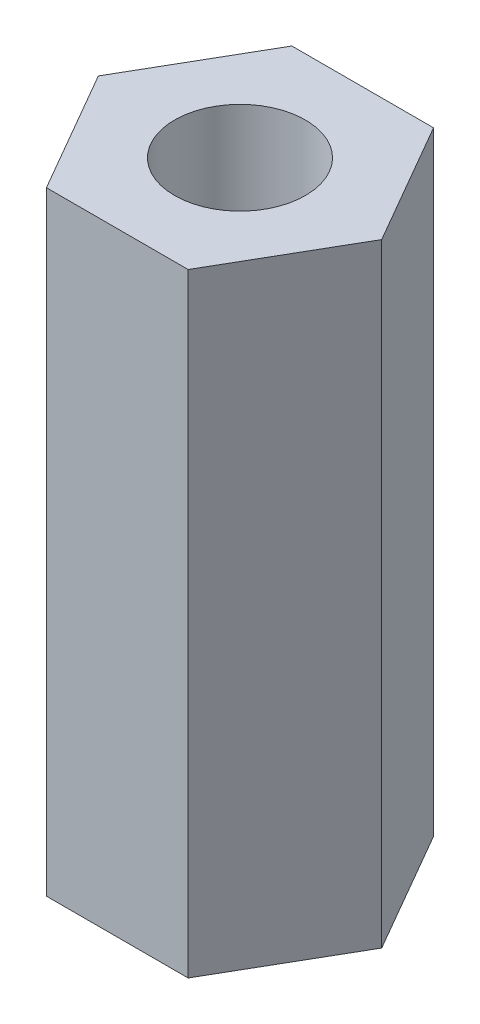
ISO-10303-21;
HEADER;
FILE_DESCRIPTION(('STEP AP214'),'2;1');
FILE_NAME('part.step','',(''),(''),'','','');
FILE_SCHEMA(('AUTOMOTIVE_DESIGN { 1 0 10303 214 1 1 1 1 }'));
ENDSEC;
DATA;
#1=APPLICATION_CONTEXT('core data for automotive mechanical design processes');
#2=APPLICATION_PROTOCOL_DEFINITION('international standard','automotive_design',2000,#1);
#3=PRODUCT_CONTEXT('',#1,'mechanical');
#4=PRODUCT('Part','Part','',(#3));
#5=PRODUCT_RELATED_PRODUCT_CATEGORY('part','',(#4));
#6=PRODUCT_DEFINITION_FORMATION('','',#4);
#7=PRODUCT_DEFINITION_CONTEXT('part definition',#1,'design');
#8=PRODUCT_DEFINITION('design','',#6,#7);
#9=PRODUCT_DEFINITION_SHAPE('','',#8);
#10=(LENGTH_UNIT() NAMED_UNIT(*) SI_UNIT(.MILLI.,.METRE.));
#11=(NAMED_UNIT(*) PLANE_ANGLE_UNIT() SI_UNIT($,.RADIAN.));
#12=(NAMED_UNIT(*) SI_UNIT($,.STERADIAN.) SOLID_ANGLE_UNIT());
#13=UNCERTAINTY_MEASURE_WITH_UNIT(LENGTH_MEASURE(1.E-05),#10,'distance_accuracy_value','');
#14=(GEOMETRIC_REPRESENTATION_CONTEXT(3) GLOBAL_UNCERTAINTY_ASSIGNED_CONTEXT((#13)) GLOBAL_UNIT_ASSIGNED_CONTEXT((#10,
#11,#12)) REPRESENTATION_CONTEXT('',''));
#15=CARTESIAN_POINT('',(0.,0.,0.));
#16=DIRECTION('',(0.,0.,1.));
#17=DIRECTION('',(1.,0.,0.));
#18=AXIS2_PLACEMENT_3D('',#15,#16,#17);
#19=CARTESIAN_POINT('',(0.,15.,0.));
#20=DIRECTION('',(0.,1.,0.));
#21=DIRECTION('',(0.,0.,1.));
#22=AXIS2_PLACEMENT_3D('',#19,#20,#21);
#23=PLANE('',#22);
#24=DIRECTION('',(0.499999999999995,0.,-0.866025403784441));
#25=VECTOR('',#24,1.);
#26=CARTESIAN_POINT('',(1.73205080756891,15.,2.99999999999997));
#27=LINE('',#26,#25);
#28=CARTESIAN_POINT('',(1.73205080756891,15.,2.99999999999997));
#29=VERTEX_POINT('',#28);
#30=CARTESIAN_POINT('',(3.46410161513774,15.,0.));
#31=VERTEX_POINT('',#30);
#32=EDGE_CURVE('E137',#29,#31,#27,.T.);
#33=ORIENTED_EDGE('',*,*,#32,.T.);
#34=DIRECTION('',(-0.500000000000001,0.,-0.866025403784438));
#35=VECTOR('',#34,1.);
#36=CARTESIAN_POINT('',(3.46410161513774,15.,0.));
#37=LINE('',#36,#35);
#38=CARTESIAN_POINT('',(1.73205080756886,15.,-2.99999999999999));
#39=VERTEX_POINT('',#38);
#40=EDGE_CURVE('E95',#31,#39,#37,.T.);
#41=ORIENTED_EDGE('',*,*,#40,.T.);
#42=DIRECTION('',(-1.,0.,0.));
#43=VECTOR('',#42,1.);
#44=CARTESIAN_POINT('',(1.73205080756886,15.,-2.99999999999999));
#45=LINE('',#44,#43);
#46=CARTESIAN_POINT('',(-1.73205080756889,15.,-2.99999999999998));
#47=VERTEX_POINT('',#46);
#48=EDGE_CURVE('E108',#39,#47,#45,.T.);
#49=ORIENTED_EDGE('',*,*,#48,.T.);
#50=DIRECTION('',(-0.499999999999995,0.,0.866025403784442));
#51=VECTOR('',#50,1.);
#52=CARTESIAN_POINT('',(-1.73205080756889,15.,-2.99999999999998));
#53=LINE('',#52,#51);
#54=CARTESIAN_POINT('',(-3.46410161513774,15.,0.));
#55=VERTEX_POINT('',#54);
#56=EDGE_CURVE('E102',#47,#55,#53,.T.);
#57=ORIENTED_EDGE('',*,*,#56,.T.);
#58=DIRECTION('',(0.500000000000007,0.,0.866025403784435));
#59=VECTOR('',#58,1.);
#60=CARTESIAN_POINT('',(-3.46410161513774,15.,0.));
#61=LINE('',#60,#59);
#62=CARTESIAN_POINT('',(-1.73205080756884,15.,3.00000000000001));
#63=VERTEX_POINT('',#62);
#64=EDGE_CURVE('E106',#55,#63,#61,.T.);
#65=ORIENTED_EDGE('',*,*,#64,.T.);
#66=DIRECTION('',(1.,0.,0.));
#67=VECTOR('',#66,1.);
#68=CARTESIAN_POINT('',(-1.73205080756884,15.,3.00000000000001));
#69=LINE('',#68,#67);
#70=EDGE_CURVE('E58',#63,#29,#69,.T.);
#71=ORIENTED_EDGE('',*,*,#70,.T.);
#72=EDGE_LOOP('',(#33,#41,#49,#57,#65,#71));
#73=FACE_BOUND('',#72,.T.);
#74=CARTESIAN_POINT('',(0.,15.,0.));
#75=DIRECTION('',(0.,1.,0.));
#76=DIRECTION('',(0.,0.,1.));
#77=AXIS2_PLACEMENT_3D('',#74,#75,#76);
#78=CIRCLE('',#77,1.6);
#79=CARTESIAN_POINT('',(0.,15.,1.6));
#80=VERTEX_POINT('',#79);
#81=EDGE_CURVE('E130',#80,#80,#78,.T.);
#82=ORIENTED_EDGE('',*,*,#81,.F.);
#83=EDGE_LOOP('',(#82));
#84=FACE_BOUND('',#83,.T.);
#85=ADVANCED_FACE('F41',(#73,#84),#23,.T.);
#86=CARTESIAN_POINT('',(0.,0.,0.));
#87=DIRECTION('',(0.,1.,0.));
#88=DIRECTION('',(0.,0.,1.));
#89=AXIS2_PLACEMENT_3D('',#86,#87,#88);
#90=PLANE('',#89);
#91=DIRECTION('',(0.499999999999995,0.,-0.866025403784441));
#92=VECTOR('',#91,1.);
#93=CARTESIAN_POINT('',(1.73205080756891,0.,2.99999999999997));
#94=LINE('',#93,#92);
#95=CARTESIAN_POINT('',(1.73205080756891,0.,2.99999999999997));
#96=VERTEX_POINT('',#95);
#97=CARTESIAN_POINT('',(3.46410161513774,0.,0.));
#98=VERTEX_POINT('',#97);
#99=EDGE_CURVE('E126',#96,#98,#94,.T.);
#100=ORIENTED_EDGE('',*,*,#99,.F.);
#101=DIRECTION('',(1.,0.,0.));
#102=VECTOR('',#101,1.);
#103=CARTESIAN_POINT('',(-1.73205080756884,0.,3.00000000000001));
#104=LINE('',#103,#102);
#105=CARTESIAN_POINT('',(-1.73205080756884,0.,3.00000000000001));
#106=VERTEX_POINT('',#105);
#107=EDGE_CURVE('E87',#106,#96,#104,.T.);
#108=ORIENTED_EDGE('',*,*,#107,.F.);
#109=DIRECTION('',(0.500000000000007,0.,0.866025403784435));
#110=VECTOR('',#109,1.);
#111=CARTESIAN_POINT('',(-3.46410161513774,0.,0.));
#112=LINE('',#111,#110);
#113=CARTESIAN_POINT('',(-3.46410161513774,0.,0.));
#114=VERTEX_POINT('',#113);
#115=EDGE_CURVE('E81',#114,#106,#112,.T.);
#116=ORIENTED_EDGE('',*,*,#115,.F.);
#117=DIRECTION('',(-0.499999999999995,0.,0.866025403784442));
#118=VECTOR('',#117,1.);
#119=CARTESIAN_POINT('',(-1.73205080756889,0.,-2.99999999999998));
#120=LINE('',#119,#118);
#121=CARTESIAN_POINT('',(-1.73205080756889,0.,-2.99999999999998));
#122=VERTEX_POINT('',#121);
#123=EDGE_CURVE('E116',#122,#114,#120,.T.);
#124=ORIENTED_EDGE('',*,*,#123,.F.);
#125=DIRECTION('',(-1.,0.,0.));
#126=VECTOR('',#125,1.);
#127=CARTESIAN_POINT('',(1.73205080756886,0.,-2.99999999999999));
#128=LINE('',#127,#126);
#129=CARTESIAN_POINT('',(1.73205080756886,0.,-2.99999999999999));
#130=VERTEX_POINT('',#129);
#131=EDGE_CURVE('E132',#130,#122,#128,.T.);
#132=ORIENTED_EDGE('',*,*,#131,.F.);
#133=DIRECTION('',(-0.500000000000001,0.,-0.866025403784438));
#134=VECTOR('',#133,1.);
#135=CARTESIAN_POINT('',(3.46410161513774,0.,0.));
#136=LINE('',#135,#134);
#137=EDGE_CURVE('E129',#98,#130,#136,.T.);
#138=ORIENTED_EDGE('',*,*,#137,.F.);
#139=EDGE_LOOP('',(#100,#108,#116,#124,#132,#138));
#140=FACE_BOUND('',#139,.T.);
#141=CARTESIAN_POINT('',(0.,0.,0.));
#142=DIRECTION('',(0.,1.,0.));
#143=DIRECTION('',(0.,0.,1.));
#144=AXIS2_PLACEMENT_3D('',#141,#142,#143);
#145=CIRCLE('',#144,1.6);
#146=CARTESIAN_POINT('',(0.,0.,1.6));
#147=VERTEX_POINT('',#146);
#148=EDGE_CURVE('E238',#147,#147,#145,.T.);
#149=ORIENTED_EDGE('',*,*,#148,.T.);
#150=EDGE_LOOP('',(#149));
#151=FACE_BOUND('',#150,.T.);
#152=ADVANCED_FACE('F146',(#140,#151),#90,.F.);
#153=CARTESIAN_POINT('',(1.73205080756891,15.,2.99999999999997));
#154=DIRECTION('',(-0.866025403784442,0.,-0.499999999999995));
#155=DIRECTION('',(-0.499999999999995,0.,0.866025403784442));
#156=AXIS2_PLACEMENT_3D('',#153,#154,#155);
#157=PLANE('',#156);
#158=ORIENTED_EDGE('',*,*,#99,.T.);
#159=DIRECTION('',(0.,-1.,0.));
#160=VECTOR('',#159,1.);
#161=CARTESIAN_POINT('',(3.46410161513774,15.,0.));
#162=LINE('',#161,#160);
#163=EDGE_CURVE('E11',#31,#98,#162,.T.);
#164=ORIENTED_EDGE('',*,*,#163,.F.);
#165=ORIENTED_EDGE('',*,*,#32,.F.);
#166=DIRECTION('',(0.,-1.,0.));
#167=VECTOR('',#166,1.);
#168=CARTESIAN_POINT('',(1.73205080756891,15.,2.99999999999997));
#169=LINE('',#168,#167);
#170=EDGE_CURVE('E122',#29,#96,#169,.T.);
#171=ORIENTED_EDGE('',*,*,#170,.T.);
#172=EDGE_LOOP('',(#158,#164,#165,#171));
#173=FACE_BOUND('',#172,.T.);
#174=ADVANCED_FACE('F43',(#173),#157,.F.);
#175=CARTESIAN_POINT('',(3.46410161513774,15.,0.));
#176=DIRECTION('',(-0.866025403784438,0.,0.500000000000001));
#177=DIRECTION('',(0.500000000000001,0.,0.866025403784438));
#178=AXIS2_PLACEMENT_3D('',#175,#176,#177);
#179=PLANE('',#178);
#180=ORIENTED_EDGE('',*,*,#137,.T.);
#181=DIRECTION('',(0.,-1.,0.));
#182=VECTOR('',#181,1.);
#183=CARTESIAN_POINT('',(1.73205080756886,15.,-2.99999999999999));
#184=LINE('',#183,#182);
#185=EDGE_CURVE('E50',#39,#130,#184,.T.);
#186=ORIENTED_EDGE('',*,*,#185,.F.);
#187=ORIENTED_EDGE('',*,*,#40,.F.);
#188=ORIENTED_EDGE('',*,*,#163,.T.);
#189=EDGE_LOOP('',(#180,#186,#187,#188));
#190=FACE_BOUND('',#189,.T.);
#191=ADVANCED_FACE('F171',(#190),#179,.F.);
#192=CARTESIAN_POINT('',(1.73205080756886,15.,-2.99999999999999));
#193=DIRECTION('',(0.,0.,1.));
#194=DIRECTION('',(1.,0.,0.));
#195=AXIS2_PLACEMENT_3D('',#192,#193,#194);
#196=PLANE('',#195);
#197=ORIENTED_EDGE('',*,*,#131,.T.);
#198=DIRECTION('',(0.,-1.,0.));
#199=VECTOR('',#198,1.);
#200=CARTESIAN_POINT('',(-1.73205080756889,15.,-2.99999999999998));
#201=LINE('',#200,#199);
#202=EDGE_CURVE('E117',#47,#122,#201,.T.);
#203=ORIENTED_EDGE('',*,*,#202,.F.);
#204=ORIENTED_EDGE('',*,*,#48,.F.);
#205=ORIENTED_EDGE('',*,*,#185,.T.);
#206=EDGE_LOOP('',(#197,#203,#204,#205));
#207=FACE_BOUND('',#206,.T.);
#208=ADVANCED_FACE('F143',(#207),#196,.F.);
#209=CARTESIAN_POINT('',(-1.73205080756889,15.,-2.99999999999998));
#210=DIRECTION('',(0.866025403784442,0.,0.499999999999995));
#211=DIRECTION('',(0.499999999999995,0.,-0.866025403784442));
#212=AXIS2_PLACEMENT_3D('',#209,#210,#211);
#213=PLANE('',#212);
#214=ORIENTED_EDGE('',*,*,#123,.T.);
#215=DIRECTION('',(0.,-1.,0.));
#216=VECTOR('',#215,1.);
#217=CARTESIAN_POINT('',(-3.46410161513774,15.,0.));
#218=LINE('',#217,#216);
#219=EDGE_CURVE('E113',#55,#114,#218,.T.);
#220=ORIENTED_EDGE('',*,*,#219,.F.);
#221=ORIENTED_EDGE('',*,*,#56,.F.);
#222=ORIENTED_EDGE('',*,*,#202,.T.);
#223=EDGE_LOOP('',(#214,#220,#221,#222));
#224=FACE_BOUND('',#223,.T.);
#225=ADVANCED_FACE('F114',(#224),#213,.F.);
#226=CARTESIAN_POINT('',(-3.46410161513774,15.,0.));
#227=DIRECTION('',(0.866025403784435,0.,-0.500000000000007));
#228=DIRECTION('',(-0.500000000000007,0.,-0.866025403784435));
#229=AXIS2_PLACEMENT_3D('',#226,#227,#228);
#230=PLANE('',#229);
#231=ORIENTED_EDGE('',*,*,#115,.T.);
#232=DIRECTION('',(0.,-1.,0.));
#233=VECTOR('',#232,1.);
#234=CARTESIAN_POINT('',(-1.73205080756884,15.,3.00000000000001));
#235=LINE('',#234,#233);
#236=EDGE_CURVE('E118',#63,#106,#235,.T.);
#237=ORIENTED_EDGE('',*,*,#236,.F.);
#238=ORIENTED_EDGE('',*,*,#64,.F.);
#239=ORIENTED_EDGE('',*,*,#219,.T.);
#240=EDGE_LOOP('',(#231,#237,#238,#239));
#241=FACE_BOUND('',#240,.T.);
#242=ADVANCED_FACE('F120',(#241),#230,.F.);
#243=CARTESIAN_POINT('',(-1.73205080756884,15.,3.00000000000001));
#244=DIRECTION('',(0.,0.,-1.));
#245=DIRECTION('',(-1.,0.,0.));
#246=AXIS2_PLACEMENT_3D('',#243,#244,#245);
#247=PLANE('',#246);
#248=ORIENTED_EDGE('',*,*,#107,.T.);
#249=ORIENTED_EDGE('',*,*,#170,.F.);
#250=ORIENTED_EDGE('',*,*,#70,.F.);
#251=ORIENTED_EDGE('',*,*,#236,.T.);
#252=EDGE_LOOP('',(#248,#249,#250,#251));
#253=FACE_BOUND('',#252,.T.);
#254=ADVANCED_FACE('F151',(#253),#247,.F.);
#255=CARTESIAN_POINT('',(0.,15.,0.));
#256=DIRECTION('',(0.,-1.,0.));
#257=DIRECTION('',(0.,0.,-1.));
#258=AXIS2_PLACEMENT_3D('',#255,#256,#257);
#259=CYLINDRICAL_SURFACE('',#258,1.6);
#260=ORIENTED_EDGE('',*,*,#81,.T.);
#261=EDGE_LOOP('',(#260));
#262=FACE_BOUND('',#261,.T.);
#263=ORIENTED_EDGE('',*,*,#148,.F.);
#264=EDGE_LOOP('',(#263));
#265=FACE_BOUND('',#264,.T.);
#266=ADVANCED_FACE('F153',(#262,#265),#259,.F.);
#267=CLOSED_SHELL('',(#85,#152,#174,#191,#208,#225,#242,#254,#266));
#268=MANIFOLD_SOLID_BREP('B2',#267);
#269=ADVANCED_BREP_SHAPE_REPRESENTATION('',(#18,#268),#14);
#270=SHAPE_DEFINITION_REPRESENTATION(#9,#269);
ENDSEC;
END-ISO-10303-21;
